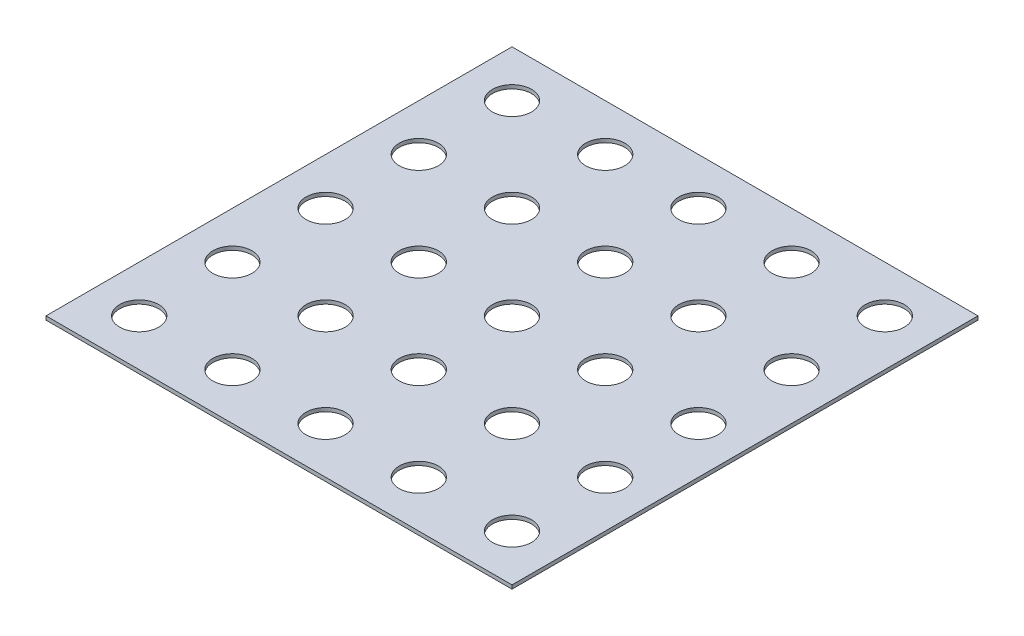
ISO-10303-21;
HEADER;
FILE_DESCRIPTION(('STEP AP214'),'2;1');
FILE_NAME('part.step','',(''),(''),'','','');
FILE_SCHEMA(('AUTOMOTIVE_DESIGN { 1 0 10303 214 1 1 1 1 }'));
ENDSEC;
DATA;
#1=APPLICATION_CONTEXT('core data for automotive mechanical design processes');
#2=APPLICATION_PROTOCOL_DEFINITION('international standard','automotive_design',2000,#1);
#3=PRODUCT_CONTEXT('',#1,'mechanical');
#4=PRODUCT('Part','Part','',(#3));
#5=PRODUCT_RELATED_PRODUCT_CATEGORY('part','',(#4));
#6=PRODUCT_DEFINITION_FORMATION('','',#4);
#7=PRODUCT_DEFINITION_CONTEXT('part definition',#1,'design');
#8=PRODUCT_DEFINITION('design','',#6,#7);
#9=PRODUCT_DEFINITION_SHAPE('','',#8);
#10=(LENGTH_UNIT() NAMED_UNIT(*) SI_UNIT(.MILLI.,.METRE.));
#11=(NAMED_UNIT(*) PLANE_ANGLE_UNIT() SI_UNIT($,.RADIAN.));
#12=(NAMED_UNIT(*) SI_UNIT($,.STERADIAN.) SOLID_ANGLE_UNIT());
#13=UNCERTAINTY_MEASURE_WITH_UNIT(LENGTH_MEASURE(1.E-05),#10,'distance_accuracy_value','');
#14=(GEOMETRIC_REPRESENTATION_CONTEXT(3) GLOBAL_UNCERTAINTY_ASSIGNED_CONTEXT((#13)) GLOBAL_UNIT_ASSIGNED_CONTEXT((#10,
#11,#12)) REPRESENTATION_CONTEXT('',''));
#15=CARTESIAN_POINT('',(0.,0.,0.));
#16=DIRECTION('',(0.,0.,1.));
#17=DIRECTION('',(1.,0.,0.));
#18=AXIS2_PLACEMENT_3D('',#15,#16,#17);
#19=CARTESIAN_POINT('',(-125.,2.,-125.));
#20=DIRECTION('',(1.,0.,0.));
#21=DIRECTION('',(0.,0.,-1.));
#22=AXIS2_PLACEMENT_3D('',#19,#20,#21);
#23=PLANE('',#22);
#24=DIRECTION('',(0.,0.,1.));
#25=VECTOR('',#24,1.);
#26=CARTESIAN_POINT('',(-125.,0.,-125.));
#27=LINE('',#26,#25);
#28=CARTESIAN_POINT('',(-125.,0.,-125.));
#29=VERTEX_POINT('',#28);
#30=CARTESIAN_POINT('',(-125.,0.,125.));
#31=VERTEX_POINT('',#30);
#32=EDGE_CURVE('E107',#29,#31,#27,.T.);
#33=ORIENTED_EDGE('',*,*,#32,.T.);
#34=DIRECTION('',(0.,-1.,0.));
#35=VECTOR('',#34,1.);
#36=CARTESIAN_POINT('',(-125.,2.,125.));
#37=LINE('',#36,#35);
#38=CARTESIAN_POINT('',(-125.,2.,125.));
#39=VERTEX_POINT('',#38);
#40=EDGE_CURVE('E11',#39,#31,#37,.T.);
#41=ORIENTED_EDGE('',*,*,#40,.F.);
#42=DIRECTION('',(0.,0.,1.));
#43=VECTOR('',#42,1.);
#44=CARTESIAN_POINT('',(-125.,2.,-125.));
#45=LINE('',#44,#43);
#46=CARTESIAN_POINT('',(-125.,2.,-125.));
#47=VERTEX_POINT('',#46);
#48=EDGE_CURVE('E91',#47,#39,#45,.T.);
#49=ORIENTED_EDGE('',*,*,#48,.F.);
#50=DIRECTION('',(0.,-1.,0.));
#51=VECTOR('',#50,1.);
#52=CARTESIAN_POINT('',(-125.,2.,-125.));
#53=LINE('',#52,#51);
#54=EDGE_CURVE('E103',#47,#29,#53,.T.);
#55=ORIENTED_EDGE('',*,*,#54,.T.);
#56=EDGE_LOOP('',(#33,#41,#49,#55));
#57=FACE_BOUND('',#56,.T.);
#58=ADVANCED_FACE('F39',(#57),#23,.F.);
#59=CARTESIAN_POINT('',(-125.,2.,125.));
#60=DIRECTION('',(0.,0.,-1.));
#61=DIRECTION('',(-1.,0.,0.));
#62=AXIS2_PLACEMENT_3D('',#59,#60,#61);
#63=PLANE('',#62);
#64=DIRECTION('',(1.,0.,0.));
#65=VECTOR('',#64,1.);
#66=CARTESIAN_POINT('',(-125.,0.,125.));
#67=LINE('',#66,#65);
#68=CARTESIAN_POINT('',(125.,0.,125.));
#69=VERTEX_POINT('',#68);
#70=EDGE_CURVE('E96',#31,#69,#67,.T.);
#71=ORIENTED_EDGE('',*,*,#70,.T.);
#72=DIRECTION('',(0.,-1.,0.));
#73=VECTOR('',#72,1.);
#74=CARTESIAN_POINT('',(125.,2.,125.));
#75=LINE('',#74,#73);
#76=CARTESIAN_POINT('',(125.,2.,125.));
#77=VERTEX_POINT('',#76);
#78=EDGE_CURVE('E48',#77,#69,#75,.T.);
#79=ORIENTED_EDGE('',*,*,#78,.F.);
#80=DIRECTION('',(1.,0.,0.));
#81=VECTOR('',#80,1.);
#82=CARTESIAN_POINT('',(-125.,2.,125.));
#83=LINE('',#82,#81);
#84=EDGE_CURVE('E86',#39,#77,#83,.T.);
#85=ORIENTED_EDGE('',*,*,#84,.F.);
#86=ORIENTED_EDGE('',*,*,#40,.T.);
#87=EDGE_LOOP('',(#71,#79,#85,#86));
#88=FACE_BOUND('',#87,.T.);
#89=ADVANCED_FACE('F95',(#88),#63,.F.);
#90=CARTESIAN_POINT('',(125.,2.,-125.));
#91=DIRECTION('',(-1.,0.,0.));
#92=DIRECTION('',(0.,0.,1.));
#93=AXIS2_PLACEMENT_3D('',#90,#91,#92);
#94=PLANE('',#93);
#95=DIRECTION('',(0.,0.,-1.));
#96=VECTOR('',#95,1.);
#97=CARTESIAN_POINT('',(125.,0.,-125.));
#98=LINE('',#97,#96);
#99=CARTESIAN_POINT('',(125.,0.,-125.));
#100=VERTEX_POINT('',#99);
#101=EDGE_CURVE('E73',#69,#100,#98,.T.);
#102=ORIENTED_EDGE('',*,*,#101,.T.);
#103=DIRECTION('',(0.,-1.,0.));
#104=VECTOR('',#103,1.);
#105=CARTESIAN_POINT('',(125.,2.,-125.));
#106=LINE('',#105,#104);
#107=CARTESIAN_POINT('',(125.,2.,-125.));
#108=VERTEX_POINT('',#107);
#109=EDGE_CURVE('E98',#108,#100,#106,.T.);
#110=ORIENTED_EDGE('',*,*,#109,.F.);
#111=DIRECTION('',(0.,0.,-1.));
#112=VECTOR('',#111,1.);
#113=CARTESIAN_POINT('',(125.,2.,-125.));
#114=LINE('',#113,#112);
#115=EDGE_CURVE('E89',#77,#108,#114,.T.);
#116=ORIENTED_EDGE('',*,*,#115,.F.);
#117=ORIENTED_EDGE('',*,*,#78,.T.);
#118=EDGE_LOOP('',(#102,#110,#116,#117));
#119=FACE_BOUND('',#118,.T.);
#120=ADVANCED_FACE('F99',(#119),#94,.F.);
#121=CARTESIAN_POINT('',(-125.,2.,-125.));
#122=DIRECTION('',(0.,0.,1.));
#123=DIRECTION('',(1.,0.,0.));
#124=AXIS2_PLACEMENT_3D('',#121,#122,#123);
#125=PLANE('',#124);
#126=DIRECTION('',(-1.,0.,0.));
#127=VECTOR('',#126,1.);
#128=CARTESIAN_POINT('',(-125.,0.,-125.));
#129=LINE('',#128,#127);
#130=EDGE_CURVE('E79',#100,#29,#129,.T.);
#131=ORIENTED_EDGE('',*,*,#130,.T.);
#132=ORIENTED_EDGE('',*,*,#54,.F.);
#133=DIRECTION('',(-1.,0.,0.));
#134=VECTOR('',#133,1.);
#135=CARTESIAN_POINT('',(-125.,2.,-125.));
#136=LINE('',#135,#134);
#137=EDGE_CURVE('E56',#108,#47,#136,.T.);
#138=ORIENTED_EDGE('',*,*,#137,.F.);
#139=ORIENTED_EDGE('',*,*,#109,.T.);
#140=EDGE_LOOP('',(#131,#132,#138,#139));
#141=FACE_BOUND('',#140,.T.);
#142=ADVANCED_FACE('F121',(#141),#125,.F.);
#143=CARTESIAN_POINT('',(0.,2.,0.));
#144=DIRECTION('',(0.,1.,0.));
#145=DIRECTION('',(0.,0.,1.));
#146=AXIS2_PLACEMENT_3D('',#143,#144,#145);
#147=PLANE('',#146);
#148=CARTESIAN_POINT('',(-50.,2.,-100.));
#149=DIRECTION('',(0.,1.,0.));
#150=DIRECTION('',(0.,0.,1.));
#151=AXIS2_PLACEMENT_3D('',#148,#149,#150);
#152=CIRCLE('',#151,10.5);
#153=CARTESIAN_POINT('',(-50.,2.,-89.5));
#154=VERTEX_POINT('',#153);
#155=EDGE_CURVE('E257',#154,#154,#152,.T.);
#156=ORIENTED_EDGE('',*,*,#155,.F.);
#157=EDGE_LOOP('',(#156));
#158=FACE_BOUND('',#157,.T.);
#159=CARTESIAN_POINT('',(0.,2.,-100.));
#160=DIRECTION('',(0.,1.,0.));
#161=DIRECTION('',(0.,0.,1.));
#162=AXIS2_PLACEMENT_3D('',#159,#160,#161);
#163=CIRCLE('',#162,10.5);
#164=CARTESIAN_POINT('',(0.,2.,-89.5));
#165=VERTEX_POINT('',#164);
#166=EDGE_CURVE('E249',#165,#165,#163,.T.);
#167=ORIENTED_EDGE('',*,*,#166,.F.);
#168=EDGE_LOOP('',(#167));
#169=FACE_BOUND('',#168,.T.);
#170=CARTESIAN_POINT('',(50.,2.,-100.));
#171=DIRECTION('',(0.,1.,0.));
#172=DIRECTION('',(0.,0.,1.));
#173=AXIS2_PLACEMENT_3D('',#170,#171,#172);
#174=CIRCLE('',#173,10.5);
#175=CARTESIAN_POINT('',(50.,2.,-89.5));
#176=VERTEX_POINT('',#175);
#177=EDGE_CURVE('E241',#176,#176,#174,.T.);
#178=ORIENTED_EDGE('',*,*,#177,.F.);
#179=EDGE_LOOP('',(#178));
#180=FACE_BOUND('',#179,.T.);
#181=CARTESIAN_POINT('',(100.,2.,-100.));
#182=DIRECTION('',(0.,1.,0.));
#183=DIRECTION('',(0.,0.,1.));
#184=AXIS2_PLACEMENT_3D('',#181,#182,#183);
#185=CIRCLE('',#184,10.5);
#186=CARTESIAN_POINT('',(100.,2.,-89.5));
#187=VERTEX_POINT('',#186);
#188=EDGE_CURVE('E233',#187,#187,#185,.T.);
#189=ORIENTED_EDGE('',*,*,#188,.F.);
#190=EDGE_LOOP('',(#189));
#191=FACE_BOUND('',#190,.T.);
#192=CARTESIAN_POINT('',(-49.9999999999995,2.,-50.));
#193=DIRECTION('',(0.,1.,0.));
#194=DIRECTION('',(0.,0.,1.));
#195=AXIS2_PLACEMENT_3D('',#192,#193,#194);
#196=CIRCLE('',#195,10.5);
#197=CARTESIAN_POINT('',(-49.9999999999995,2.,-39.5));
#198=VERTEX_POINT('',#197);
#199=EDGE_CURVE('E225',#198,#198,#196,.T.);
#200=ORIENTED_EDGE('',*,*,#199,.F.);
#201=EDGE_LOOP('',(#200));
#202=FACE_BOUND('',#201,.T.);
#203=CARTESIAN_POINT('',(5.55111512312578E-13,2.,-50.));
#204=DIRECTION('',(0.,1.,0.));
#205=DIRECTION('',(0.,0.,1.));
#206=AXIS2_PLACEMENT_3D('',#203,#204,#205);
#207=CIRCLE('',#206,10.5);
#208=CARTESIAN_POINT('',(5.55111512312578E-13,2.,-39.5));
#209=VERTEX_POINT('',#208);
#210=EDGE_CURVE('E217',#209,#209,#207,.T.);
#211=ORIENTED_EDGE('',*,*,#210,.F.);
#212=EDGE_LOOP('',(#211));
#213=FACE_BOUND('',#212,.T.);
#214=CARTESIAN_POINT('',(50.0000000000006,2.,-50.));
#215=DIRECTION('',(0.,1.,0.));
#216=DIRECTION('',(0.,0.,1.));
#217=AXIS2_PLACEMENT_3D('',#214,#215,#216);
#218=CIRCLE('',#217,10.5);
#219=CARTESIAN_POINT('',(50.0000000000006,2.,-39.5));
#220=VERTEX_POINT('',#219);
#221=EDGE_CURVE('E209',#220,#220,#218,.T.);
#222=ORIENTED_EDGE('',*,*,#221,.F.);
#223=EDGE_LOOP('',(#222));
#224=FACE_BOUND('',#223,.T.);
#225=CARTESIAN_POINT('',(100.000000000001,2.,-50.));
#226=DIRECTION('',(0.,1.,0.));
#227=DIRECTION('',(0.,0.,1.));
#228=AXIS2_PLACEMENT_3D('',#225,#226,#227);
#229=CIRCLE('',#228,10.5);
#230=CARTESIAN_POINT('',(100.000000000001,2.,-39.5));
#231=VERTEX_POINT('',#230);
#232=EDGE_CURVE('E201',#231,#231,#229,.T.);
#233=ORIENTED_EDGE('',*,*,#232,.F.);
#234=EDGE_LOOP('',(#233));
#235=FACE_BOUND('',#234,.T.);
#236=CARTESIAN_POINT('',(-49.9999999999989,2.,0.));
#237=DIRECTION('',(0.,1.,0.));
#238=DIRECTION('',(0.,0.,1.));
#239=AXIS2_PLACEMENT_3D('',#236,#237,#238);
#240=CIRCLE('',#239,10.5);
#241=CARTESIAN_POINT('',(-49.9999999999989,2.,10.5));
#242=VERTEX_POINT('',#241);
#243=EDGE_CURVE('E193',#242,#242,#240,.T.);
#244=ORIENTED_EDGE('',*,*,#243,.F.);
#245=EDGE_LOOP('',(#244));
#246=FACE_BOUND('',#245,.T.);
#247=CARTESIAN_POINT('',(1.06858966120171E-12,2.,0.));
#248=DIRECTION('',(0.,1.,0.));
#249=DIRECTION('',(0.,0.,1.));
#250=AXIS2_PLACEMENT_3D('',#247,#248,#249);
#251=CIRCLE('',#250,10.5);
#252=CARTESIAN_POINT('',(1.06858966120171E-12,2.,10.5));
#253=VERTEX_POINT('',#252);
#254=EDGE_CURVE('E185',#253,#253,#251,.T.);
#255=ORIENTED_EDGE('',*,*,#254,.F.);
#256=EDGE_LOOP('',(#255));
#257=FACE_BOUND('',#256,.T.);
#258=CARTESIAN_POINT('',(50.0000000000011,2.,0.));
#259=DIRECTION('',(0.,1.,0.));
#260=DIRECTION('',(0.,0.,1.));
#261=AXIS2_PLACEMENT_3D('',#258,#259,#260);
#262=CIRCLE('',#261,10.5);
#263=CARTESIAN_POINT('',(50.0000000000011,2.,10.5));
#264=VERTEX_POINT('',#263);
#265=EDGE_CURVE('E177',#264,#264,#262,.T.);
#266=ORIENTED_EDGE('',*,*,#265,.F.);
#267=EDGE_LOOP('',(#266));
#268=FACE_BOUND('',#267,.T.);
#269=CARTESIAN_POINT('',(100.000000000001,2.,0.));
#270=DIRECTION('',(0.,1.,0.));
#271=DIRECTION('',(0.,0.,1.));
#272=AXIS2_PLACEMENT_3D('',#269,#270,#271);
#273=CIRCLE('',#272,10.5);
#274=CARTESIAN_POINT('',(100.000000000001,2.,10.5));
#275=VERTEX_POINT('',#274);
#276=EDGE_CURVE('E169',#275,#275,#273,.T.);
#277=ORIENTED_EDGE('',*,*,#276,.F.);
#278=EDGE_LOOP('',(#277));
#279=FACE_BOUND('',#278,.T.);
#280=CARTESIAN_POINT('',(-49.9999999999984,2.,50.));
#281=DIRECTION('',(0.,1.,0.));
#282=DIRECTION('',(0.,0.,1.));
#283=AXIS2_PLACEMENT_3D('',#280,#281,#282);
#284=CIRCLE('',#283,10.5);
#285=CARTESIAN_POINT('',(-49.9999999999984,2.,60.5));
#286=VERTEX_POINT('',#285);
#287=EDGE_CURVE('E161',#286,#286,#284,.T.);
#288=ORIENTED_EDGE('',*,*,#287,.F.);
#289=EDGE_LOOP('',(#288));
#290=FACE_BOUND('',#289,.T.);
#291=CARTESIAN_POINT('',(1.59594559789866E-12,2.,50.));
#292=DIRECTION('',(0.,1.,0.));
#293=DIRECTION('',(0.,0.,1.));
#294=AXIS2_PLACEMENT_3D('',#291,#292,#293);
#295=CIRCLE('',#294,10.5);
#296=CARTESIAN_POINT('',(1.59594559789866E-12,2.,60.5));
#297=VERTEX_POINT('',#296);
#298=EDGE_CURVE('E153',#297,#297,#295,.T.);
#299=ORIENTED_EDGE('',*,*,#298,.F.);
#300=EDGE_LOOP('',(#299));
#301=FACE_BOUND('',#300,.T.);
#302=CARTESIAN_POINT('',(50.0000000000016,2.,50.));
#303=DIRECTION('',(0.,1.,0.));
#304=DIRECTION('',(0.,0.,1.));
#305=AXIS2_PLACEMENT_3D('',#302,#303,#304);
#306=CIRCLE('',#305,10.5);
#307=CARTESIAN_POINT('',(50.0000000000016,2.,60.5));
#308=VERTEX_POINT('',#307);
#309=EDGE_CURVE('E145',#308,#308,#306,.T.);
#310=ORIENTED_EDGE('',*,*,#309,.F.);
#311=EDGE_LOOP('',(#310));
#312=FACE_BOUND('',#311,.T.);
#313=CARTESIAN_POINT('',(100.000000000002,2.,50.));
#314=DIRECTION('',(0.,1.,0.));
#315=DIRECTION('',(0.,0.,1.));
#316=AXIS2_PLACEMENT_3D('',#313,#314,#315);
#317=CIRCLE('',#316,10.5);
#318=CARTESIAN_POINT('',(100.000000000002,2.,60.5));
#319=VERTEX_POINT('',#318);
#320=EDGE_CURVE('E136',#319,#319,#317,.T.);
#321=ORIENTED_EDGE('',*,*,#320,.F.);
#322=EDGE_LOOP('',(#321));
#323=FACE_BOUND('',#322,.T.);
#324=CARTESIAN_POINT('',(-49.9999999999979,2.,100.));
#325=DIRECTION('',(0.,1.,0.));
#326=DIRECTION('',(0.,0.,1.));
#327=AXIS2_PLACEMENT_3D('',#324,#325,#326);
#328=CIRCLE('',#327,10.5);
#329=CARTESIAN_POINT('',(-49.9999999999979,2.,110.5));
#330=VERTEX_POINT('',#329);
#331=EDGE_CURVE('E320',#330,#330,#328,.T.);
#332=ORIENTED_EDGE('',*,*,#331,.F.);
#333=EDGE_LOOP('',(#332));
#334=FACE_BOUND('',#333,.T.);
#335=CARTESIAN_POINT('',(2.1094237467878E-12,2.,100.));
#336=DIRECTION('',(0.,1.,0.));
#337=DIRECTION('',(0.,0.,1.));
#338=AXIS2_PLACEMENT_3D('',#335,#336,#337);
#339=CIRCLE('',#338,10.5);
#340=CARTESIAN_POINT('',(2.1094237467878E-12,2.,110.5));
#341=VERTEX_POINT('',#340);
#342=EDGE_CURVE('E312',#341,#341,#339,.T.);
#343=ORIENTED_EDGE('',*,*,#342,.F.);
#344=EDGE_LOOP('',(#343));
#345=FACE_BOUND('',#344,.T.);
#346=CARTESIAN_POINT('',(50.0000000000021,2.,100.));
#347=DIRECTION('',(0.,1.,0.));
#348=DIRECTION('',(0.,0.,1.));
#349=AXIS2_PLACEMENT_3D('',#346,#347,#348);
#350=CIRCLE('',#349,10.5);
#351=CARTESIAN_POINT('',(50.0000000000021,2.,110.5));
#352=VERTEX_POINT('',#351);
#353=EDGE_CURVE('E304',#352,#352,#350,.T.);
#354=ORIENTED_EDGE('',*,*,#353,.F.);
#355=EDGE_LOOP('',(#354));
#356=FACE_BOUND('',#355,.T.);
#357=CARTESIAN_POINT('',(100.000000000002,2.,100.));
#358=DIRECTION('',(0.,1.,0.));
#359=DIRECTION('',(0.,0.,1.));
#360=AXIS2_PLACEMENT_3D('',#357,#358,#359);
#361=CIRCLE('',#360,10.5);
#362=CARTESIAN_POINT('',(100.000000000002,2.,110.5));
#363=VERTEX_POINT('',#362);
#364=EDGE_CURVE('E296',#363,#363,#361,.T.);
#365=ORIENTED_EDGE('',*,*,#364,.F.);
#366=EDGE_LOOP('',(#365));
#367=FACE_BOUND('',#366,.T.);
#368=CARTESIAN_POINT('',(-99.9999999999994,2.,-50.));
#369=DIRECTION('',(0.,1.,0.));
#370=DIRECTION('',(0.,0.,1.));
#371=AXIS2_PLACEMENT_3D('',#368,#369,#370);
#372=CIRCLE('',#371,10.5);
#373=CARTESIAN_POINT('',(-99.9999999999994,2.,-39.5));
#374=VERTEX_POINT('',#373);
#375=EDGE_CURVE('E288',#374,#374,#372,.T.);
#376=ORIENTED_EDGE('',*,*,#375,.F.);
#377=EDGE_LOOP('',(#376));
#378=FACE_BOUND('',#377,.T.);
#379=CARTESIAN_POINT('',(-99.9999999999989,2.,0.));
#380=DIRECTION('',(0.,1.,0.));
#381=DIRECTION('',(0.,0.,1.));
#382=AXIS2_PLACEMENT_3D('',#379,#380,#381);
#383=CIRCLE('',#382,10.5);
#384=CARTESIAN_POINT('',(-99.9999999999989,2.,10.5));
#385=VERTEX_POINT('',#384);
#386=EDGE_CURVE('E280',#385,#385,#383,.T.);
#387=ORIENTED_EDGE('',*,*,#386,.F.);
#388=EDGE_LOOP('',(#387));
#389=FACE_BOUND('',#388,.T.);
#390=CARTESIAN_POINT('',(-99.9999999999984,2.,50.));
#391=DIRECTION('',(0.,1.,0.));
#392=DIRECTION('',(0.,0.,1.));
#393=AXIS2_PLACEMENT_3D('',#390,#391,#392);
#394=CIRCLE('',#393,10.5);
#395=CARTESIAN_POINT('',(-99.9999999999984,2.,60.5));
#396=VERTEX_POINT('',#395);
#397=EDGE_CURVE('E272',#396,#396,#394,.T.);
#398=ORIENTED_EDGE('',*,*,#397,.F.);
#399=EDGE_LOOP('',(#398));
#400=FACE_BOUND('',#399,.T.);
#401=CARTESIAN_POINT('',(-99.9999999999979,2.,100.));
#402=DIRECTION('',(0.,1.,0.));
#403=DIRECTION('',(0.,0.,1.));
#404=AXIS2_PLACEMENT_3D('',#401,#402,#403);
#405=CIRCLE('',#404,10.5);
#406=CARTESIAN_POINT('',(-99.9999999999979,2.,110.5));
#407=VERTEX_POINT('',#406);
#408=EDGE_CURVE('E264',#407,#407,#405,.T.);
#409=ORIENTED_EDGE('',*,*,#408,.F.);
#410=EDGE_LOOP('',(#409));
#411=FACE_BOUND('',#410,.T.);
#412=CARTESIAN_POINT('',(-100.,2.,-100.));
#413=DIRECTION('',(0.,1.,0.));
#414=DIRECTION('',(0.,0.,1.));
#415=AXIS2_PLACEMENT_3D('',#412,#413,#414);
#416=CIRCLE('',#415,10.5);
#417=CARTESIAN_POINT('',(-100.,2.,-89.5));
#418=VERTEX_POINT('',#417);
#419=EDGE_CURVE('E128',#418,#418,#416,.T.);
#420=ORIENTED_EDGE('',*,*,#419,.F.);
#421=EDGE_LOOP('',(#420));
#422=FACE_BOUND('',#421,.T.);
#423=ORIENTED_EDGE('',*,*,#48,.T.);
#424=ORIENTED_EDGE('',*,*,#84,.T.);
#425=ORIENTED_EDGE('',*,*,#115,.T.);
#426=ORIENTED_EDGE('',*,*,#137,.T.);
#427=EDGE_LOOP('',(#423,#424,#425,#426));
#428=FACE_BOUND('',#427,.T.);
#429=ADVANCED_FACE('F87',(#158,#169,#180,#191,#202,#213,#224,#235,#246,#257,#268,#279,#290,#301,
#312,#323,#334,#345,#356,#367,#378,#389,#400,#411,#422,#428),#147,.T.);
#430=CARTESIAN_POINT('',(0.,0.,0.));
#431=DIRECTION('',(0.,1.,0.));
#432=DIRECTION('',(0.,0.,1.));
#433=AXIS2_PLACEMENT_3D('',#430,#431,#432);
#434=PLANE('',#433);
#435=CARTESIAN_POINT('',(-50.,0.,-100.));
#436=DIRECTION('',(0.,1.,0.));
#437=DIRECTION('',(0.,0.,1.));
#438=AXIS2_PLACEMENT_3D('',#435,#436,#437);
#439=CIRCLE('',#438,10.5);
#440=CARTESIAN_POINT('',(-50.,0.,-89.5));
#441=VERTEX_POINT('',#440);
#442=EDGE_CURVE('E132',#441,#441,#439,.T.);
#443=ORIENTED_EDGE('',*,*,#442,.T.);
#444=EDGE_LOOP('',(#443));
#445=FACE_BOUND('',#444,.T.);
#446=CARTESIAN_POINT('',(0.,0.,-100.));
#447=DIRECTION('',(0.,1.,0.));
#448=DIRECTION('',(0.,0.,1.));
#449=AXIS2_PLACEMENT_3D('',#446,#447,#448);
#450=CIRCLE('',#449,10.5);
#451=CARTESIAN_POINT('',(0.,0.,-89.5));
#452=VERTEX_POINT('',#451);
#453=EDGE_CURVE('E253',#452,#452,#450,.T.);
#454=ORIENTED_EDGE('',*,*,#453,.T.);
#455=EDGE_LOOP('',(#454));
#456=FACE_BOUND('',#455,.T.);
#457=CARTESIAN_POINT('',(50.,0.,-100.));
#458=DIRECTION('',(0.,1.,0.));
#459=DIRECTION('',(0.,0.,1.));
#460=AXIS2_PLACEMENT_3D('',#457,#458,#459);
#461=CIRCLE('',#460,10.5);
#462=CARTESIAN_POINT('',(50.,0.,-89.5));
#463=VERTEX_POINT('',#462);
#464=EDGE_CURVE('E245',#463,#463,#461,.T.);
#465=ORIENTED_EDGE('',*,*,#464,.T.);
#466=EDGE_LOOP('',(#465));
#467=FACE_BOUND('',#466,.T.);
#468=CARTESIAN_POINT('',(100.,0.,-100.));
#469=DIRECTION('',(0.,1.,0.));
#470=DIRECTION('',(0.,0.,1.));
#471=AXIS2_PLACEMENT_3D('',#468,#469,#470);
#472=CIRCLE('',#471,10.5);
#473=CARTESIAN_POINT('',(100.,0.,-89.5));
#474=VERTEX_POINT('',#473);
#475=EDGE_CURVE('E237',#474,#474,#472,.T.);
#476=ORIENTED_EDGE('',*,*,#475,.T.);
#477=EDGE_LOOP('',(#476));
#478=FACE_BOUND('',#477,.T.);
#479=CARTESIAN_POINT('',(-49.9999999999995,0.,-50.));
#480=DIRECTION('',(0.,1.,0.));
#481=DIRECTION('',(0.,0.,1.));
#482=AXIS2_PLACEMENT_3D('',#479,#480,#481);
#483=CIRCLE('',#482,10.5);
#484=CARTESIAN_POINT('',(-49.9999999999995,0.,-39.5));
#485=VERTEX_POINT('',#484);
#486=EDGE_CURVE('E229',#485,#485,#483,.T.);
#487=ORIENTED_EDGE('',*,*,#486,.T.);
#488=EDGE_LOOP('',(#487));
#489=FACE_BOUND('',#488,.T.);
#490=CARTESIAN_POINT('',(5.55111512312578E-13,0.,-50.));
#491=DIRECTION('',(0.,1.,0.));
#492=DIRECTION('',(0.,0.,1.));
#493=AXIS2_PLACEMENT_3D('',#490,#491,#492);
#494=CIRCLE('',#493,10.5);
#495=CARTESIAN_POINT('',(5.55111512312578E-13,0.,-39.5));
#496=VERTEX_POINT('',#495);
#497=EDGE_CURVE('E221',#496,#496,#494,.T.);
#498=ORIENTED_EDGE('',*,*,#497,.T.);
#499=EDGE_LOOP('',(#498));
#500=FACE_BOUND('',#499,.T.);
#501=CARTESIAN_POINT('',(50.0000000000006,0.,-50.));
#502=DIRECTION('',(0.,1.,0.));
#503=DIRECTION('',(0.,0.,1.));
#504=AXIS2_PLACEMENT_3D('',#501,#502,#503);
#505=CIRCLE('',#504,10.5);
#506=CARTESIAN_POINT('',(50.0000000000006,0.,-39.5));
#507=VERTEX_POINT('',#506);
#508=EDGE_CURVE('E213',#507,#507,#505,.T.);
#509=ORIENTED_EDGE('',*,*,#508,.T.);
#510=EDGE_LOOP('',(#509));
#511=FACE_BOUND('',#510,.T.);
#512=CARTESIAN_POINT('',(100.000000000001,0.,-50.));
#513=DIRECTION('',(0.,1.,0.));
#514=DIRECTION('',(0.,0.,1.));
#515=AXIS2_PLACEMENT_3D('',#512,#513,#514);
#516=CIRCLE('',#515,10.5);
#517=CARTESIAN_POINT('',(100.000000000001,0.,-39.5));
#518=VERTEX_POINT('',#517);
#519=EDGE_CURVE('E205',#518,#518,#516,.T.);
#520=ORIENTED_EDGE('',*,*,#519,.T.);
#521=EDGE_LOOP('',(#520));
#522=FACE_BOUND('',#521,.T.);
#523=CARTESIAN_POINT('',(-49.9999999999989,0.,0.));
#524=DIRECTION('',(0.,1.,0.));
#525=DIRECTION('',(0.,0.,1.));
#526=AXIS2_PLACEMENT_3D('',#523,#524,#525);
#527=CIRCLE('',#526,10.5);
#528=CARTESIAN_POINT('',(-49.9999999999989,0.,10.5));
#529=VERTEX_POINT('',#528);
#530=EDGE_CURVE('E197',#529,#529,#527,.T.);
#531=ORIENTED_EDGE('',*,*,#530,.T.);
#532=EDGE_LOOP('',(#531));
#533=FACE_BOUND('',#532,.T.);
#534=CARTESIAN_POINT('',(1.06858966120171E-12,0.,0.));
#535=DIRECTION('',(0.,1.,0.));
#536=DIRECTION('',(0.,0.,1.));
#537=AXIS2_PLACEMENT_3D('',#534,#535,#536);
#538=CIRCLE('',#537,10.5);
#539=CARTESIAN_POINT('',(1.06858966120171E-12,0.,10.5));
#540=VERTEX_POINT('',#539);
#541=EDGE_CURVE('E189',#540,#540,#538,.T.);
#542=ORIENTED_EDGE('',*,*,#541,.T.);
#543=EDGE_LOOP('',(#542));
#544=FACE_BOUND('',#543,.T.);
#545=CARTESIAN_POINT('',(50.0000000000011,0.,0.));
#546=DIRECTION('',(0.,1.,0.));
#547=DIRECTION('',(0.,0.,1.));
#548=AXIS2_PLACEMENT_3D('',#545,#546,#547);
#549=CIRCLE('',#548,10.5);
#550=CARTESIAN_POINT('',(50.0000000000011,0.,10.5));
#551=VERTEX_POINT('',#550);
#552=EDGE_CURVE('E181',#551,#551,#549,.T.);
#553=ORIENTED_EDGE('',*,*,#552,.T.);
#554=EDGE_LOOP('',(#553));
#555=FACE_BOUND('',#554,.T.);
#556=CARTESIAN_POINT('',(100.000000000001,0.,0.));
#557=DIRECTION('',(0.,1.,0.));
#558=DIRECTION('',(0.,0.,1.));
#559=AXIS2_PLACEMENT_3D('',#556,#557,#558);
#560=CIRCLE('',#559,10.5);
#561=CARTESIAN_POINT('',(100.000000000001,0.,10.5));
#562=VERTEX_POINT('',#561);
#563=EDGE_CURVE('E173',#562,#562,#560,.T.);
#564=ORIENTED_EDGE('',*,*,#563,.T.);
#565=EDGE_LOOP('',(#564));
#566=FACE_BOUND('',#565,.T.);
#567=CARTESIAN_POINT('',(-49.9999999999984,0.,50.));
#568=DIRECTION('',(0.,1.,0.));
#569=DIRECTION('',(0.,0.,1.));
#570=AXIS2_PLACEMENT_3D('',#567,#568,#569);
#571=CIRCLE('',#570,10.5);
#572=CARTESIAN_POINT('',(-49.9999999999984,0.,60.5));
#573=VERTEX_POINT('',#572);
#574=EDGE_CURVE('E165',#573,#573,#571,.T.);
#575=ORIENTED_EDGE('',*,*,#574,.T.);
#576=EDGE_LOOP('',(#575));
#577=FACE_BOUND('',#576,.T.);
#578=CARTESIAN_POINT('',(1.59594559789866E-12,0.,50.));
#579=DIRECTION('',(0.,1.,0.));
#580=DIRECTION('',(0.,0.,1.));
#581=AXIS2_PLACEMENT_3D('',#578,#579,#580);
#582=CIRCLE('',#581,10.5);
#583=CARTESIAN_POINT('',(1.59594559789866E-12,0.,60.5));
#584=VERTEX_POINT('',#583);
#585=EDGE_CURVE('E157',#584,#584,#582,.T.);
#586=ORIENTED_EDGE('',*,*,#585,.T.);
#587=EDGE_LOOP('',(#586));
#588=FACE_BOUND('',#587,.T.);
#589=CARTESIAN_POINT('',(50.0000000000016,0.,50.));
#590=DIRECTION('',(0.,1.,0.));
#591=DIRECTION('',(0.,0.,1.));
#592=AXIS2_PLACEMENT_3D('',#589,#590,#591);
#593=CIRCLE('',#592,10.5);
#594=CARTESIAN_POINT('',(50.0000000000016,0.,60.5));
#595=VERTEX_POINT('',#594);
#596=EDGE_CURVE('E149',#595,#595,#593,.T.);
#597=ORIENTED_EDGE('',*,*,#596,.T.);
#598=EDGE_LOOP('',(#597));
#599=FACE_BOUND('',#598,.T.);
#600=CARTESIAN_POINT('',(100.000000000002,0.,50.));
#601=DIRECTION('',(0.,1.,0.));
#602=DIRECTION('',(0.,0.,1.));
#603=AXIS2_PLACEMENT_3D('',#600,#601,#602);
#604=CIRCLE('',#603,10.5);
#605=CARTESIAN_POINT('',(100.000000000002,0.,60.5));
#606=VERTEX_POINT('',#605);
#607=EDGE_CURVE('E140',#606,#606,#604,.T.);
#608=ORIENTED_EDGE('',*,*,#607,.T.);
#609=EDGE_LOOP('',(#608));
#610=FACE_BOUND('',#609,.T.);
#611=CARTESIAN_POINT('',(-49.9999999999979,0.,100.));
#612=DIRECTION('',(0.,1.,0.));
#613=DIRECTION('',(0.,0.,1.));
#614=AXIS2_PLACEMENT_3D('',#611,#612,#613);
#615=CIRCLE('',#614,10.5);
#616=CARTESIAN_POINT('',(-49.9999999999979,0.,110.5));
#617=VERTEX_POINT('',#616);
#618=EDGE_CURVE('E141',#617,#617,#615,.T.);
#619=ORIENTED_EDGE('',*,*,#618,.T.);
#620=EDGE_LOOP('',(#619));
#621=FACE_BOUND('',#620,.T.);
#622=CARTESIAN_POINT('',(2.1094237467878E-12,0.,100.));
#623=DIRECTION('',(0.,1.,0.));
#624=DIRECTION('',(0.,0.,1.));
#625=AXIS2_PLACEMENT_3D('',#622,#623,#624);
#626=CIRCLE('',#625,10.5);
#627=CARTESIAN_POINT('',(2.1094237467878E-12,0.,110.5));
#628=VERTEX_POINT('',#627);
#629=EDGE_CURVE('E316',#628,#628,#626,.T.);
#630=ORIENTED_EDGE('',*,*,#629,.T.);
#631=EDGE_LOOP('',(#630));
#632=FACE_BOUND('',#631,.T.);
#633=CARTESIAN_POINT('',(50.0000000000021,0.,100.));
#634=DIRECTION('',(0.,1.,0.));
#635=DIRECTION('',(0.,0.,1.));
#636=AXIS2_PLACEMENT_3D('',#633,#634,#635);
#637=CIRCLE('',#636,10.5);
#638=CARTESIAN_POINT('',(50.0000000000021,0.,110.5));
#639=VERTEX_POINT('',#638);
#640=EDGE_CURVE('E308',#639,#639,#637,.T.);
#641=ORIENTED_EDGE('',*,*,#640,.T.);
#642=EDGE_LOOP('',(#641));
#643=FACE_BOUND('',#642,.T.);
#644=CARTESIAN_POINT('',(100.000000000002,0.,100.));
#645=DIRECTION('',(0.,1.,0.));
#646=DIRECTION('',(0.,0.,1.));
#647=AXIS2_PLACEMENT_3D('',#644,#645,#646);
#648=CIRCLE('',#647,10.5);
#649=CARTESIAN_POINT('',(100.000000000002,0.,110.5));
#650=VERTEX_POINT('',#649);
#651=EDGE_CURVE('E300',#650,#650,#648,.T.);
#652=ORIENTED_EDGE('',*,*,#651,.T.);
#653=EDGE_LOOP('',(#652));
#654=FACE_BOUND('',#653,.T.);
#655=CARTESIAN_POINT('',(-99.9999999999994,0.,-50.));
#656=DIRECTION('',(0.,1.,0.));
#657=DIRECTION('',(0.,0.,1.));
#658=AXIS2_PLACEMENT_3D('',#655,#656,#657);
#659=CIRCLE('',#658,10.5);
#660=CARTESIAN_POINT('',(-99.9999999999994,0.,-39.5));
#661=VERTEX_POINT('',#660);
#662=EDGE_CURVE('E292',#661,#661,#659,.T.);
#663=ORIENTED_EDGE('',*,*,#662,.T.);
#664=EDGE_LOOP('',(#663));
#665=FACE_BOUND('',#664,.T.);
#666=CARTESIAN_POINT('',(-99.9999999999989,0.,0.));
#667=DIRECTION('',(0.,1.,0.));
#668=DIRECTION('',(0.,0.,1.));
#669=AXIS2_PLACEMENT_3D('',#666,#667,#668);
#670=CIRCLE('',#669,10.5);
#671=CARTESIAN_POINT('',(-99.9999999999989,0.,10.5));
#672=VERTEX_POINT('',#671);
#673=EDGE_CURVE('E284',#672,#672,#670,.T.);
#674=ORIENTED_EDGE('',*,*,#673,.T.);
#675=EDGE_LOOP('',(#674));
#676=FACE_BOUND('',#675,.T.);
#677=CARTESIAN_POINT('',(-99.9999999999984,0.,50.));
#678=DIRECTION('',(0.,1.,0.));
#679=DIRECTION('',(0.,0.,1.));
#680=AXIS2_PLACEMENT_3D('',#677,#678,#679);
#681=CIRCLE('',#680,10.5);
#682=CARTESIAN_POINT('',(-99.9999999999984,0.,60.5));
#683=VERTEX_POINT('',#682);
#684=EDGE_CURVE('E276',#683,#683,#681,.T.);
#685=ORIENTED_EDGE('',*,*,#684,.T.);
#686=EDGE_LOOP('',(#685));
#687=FACE_BOUND('',#686,.T.);
#688=CARTESIAN_POINT('',(-99.9999999999979,0.,100.));
#689=DIRECTION('',(0.,1.,0.));
#690=DIRECTION('',(0.,0.,1.));
#691=AXIS2_PLACEMENT_3D('',#688,#689,#690);
#692=CIRCLE('',#691,10.5);
#693=CARTESIAN_POINT('',(-99.9999999999979,0.,110.5));
#694=VERTEX_POINT('',#693);
#695=EDGE_CURVE('E268',#694,#694,#692,.T.);
#696=ORIENTED_EDGE('',*,*,#695,.T.);
#697=EDGE_LOOP('',(#696));
#698=FACE_BOUND('',#697,.T.);
#699=CARTESIAN_POINT('',(-100.,0.,-100.));
#700=DIRECTION('',(0.,1.,0.));
#701=DIRECTION('',(0.,0.,1.));
#702=AXIS2_PLACEMENT_3D('',#699,#700,#701);
#703=CIRCLE('',#702,10.5);
#704=CARTESIAN_POINT('',(-100.,0.,-89.5));
#705=VERTEX_POINT('',#704);
#706=EDGE_CURVE('E111',#705,#705,#703,.T.);
#707=ORIENTED_EDGE('',*,*,#706,.T.);
#708=EDGE_LOOP('',(#707));
#709=FACE_BOUND('',#708,.T.);
#710=ORIENTED_EDGE('',*,*,#32,.F.);
#711=ORIENTED_EDGE('',*,*,#130,.F.);
#712=ORIENTED_EDGE('',*,*,#101,.F.);
#713=ORIENTED_EDGE('',*,*,#70,.F.);
#714=EDGE_LOOP('',(#710,#711,#712,#713));
#715=FACE_BOUND('',#714,.T.);
#716=ADVANCED_FACE('F124',(#445,#456,#467,#478,#489,#500,#511,#522,#533,#544,#555,#566,#577,
#588,#599,#610,#621,#632,#643,#654,#665,#676,#687,#698,#709,#715),#434,.F.);
#717=CARTESIAN_POINT('',(-100.,0.,-100.));
#718=DIRECTION('',(0.,1.,0.));
#719=DIRECTION('',(0.,0.,1.));
#720=AXIS2_PLACEMENT_3D('',#717,#718,#719);
#721=CYLINDRICAL_SURFACE('',#720,10.5);
#722=ORIENTED_EDGE('',*,*,#706,.F.);
#723=EDGE_LOOP('',(#722));
#724=FACE_BOUND('',#723,.T.);
#725=ORIENTED_EDGE('',*,*,#419,.T.);
#726=EDGE_LOOP('',(#725));
#727=FACE_BOUND('',#726,.T.);
#728=ADVANCED_FACE('F358',(#724,#727),#721,.F.);
#729=CARTESIAN_POINT('',(-99.9999999999979,0.,100.));
#730=DIRECTION('',(0.,1.,0.));
#731=DIRECTION('',(0.,0.,1.));
#732=AXIS2_PLACEMENT_3D('',#729,#730,#731);
#733=CYLINDRICAL_SURFACE('',#732,10.5);
#734=ORIENTED_EDGE('',*,*,#695,.F.);
#735=EDGE_LOOP('',(#734));
#736=FACE_BOUND('',#735,.T.);
#737=ORIENTED_EDGE('',*,*,#408,.T.);
#738=EDGE_LOOP('',(#737));
#739=FACE_BOUND('',#738,.T.);
#740=ADVANCED_FACE('F360',(#736,#739),#733,.F.);
#741=CARTESIAN_POINT('',(-99.9999999999984,0.,50.));
#742=DIRECTION('',(0.,1.,0.));
#743=DIRECTION('',(0.,0.,1.));
#744=AXIS2_PLACEMENT_3D('',#741,#742,#743);
#745=CYLINDRICAL_SURFACE('',#744,10.5);
#746=ORIENTED_EDGE('',*,*,#684,.F.);
#747=EDGE_LOOP('',(#746));
#748=FACE_BOUND('',#747,.T.);
#749=ORIENTED_EDGE('',*,*,#397,.T.);
#750=EDGE_LOOP('',(#749));
#751=FACE_BOUND('',#750,.T.);
#752=ADVANCED_FACE('F367',(#748,#751),#745,.F.);
#753=CARTESIAN_POINT('',(-99.9999999999989,0.,0.));
#754=DIRECTION('',(0.,1.,0.));
#755=DIRECTION('',(0.,0.,1.));
#756=AXIS2_PLACEMENT_3D('',#753,#754,#755);
#757=CYLINDRICAL_SURFACE('',#756,10.5);
#758=ORIENTED_EDGE('',*,*,#673,.F.);
#759=EDGE_LOOP('',(#758));
#760=FACE_BOUND('',#759,.T.);
#761=ORIENTED_EDGE('',*,*,#386,.T.);
#762=EDGE_LOOP('',(#761));
#763=FACE_BOUND('',#762,.T.);
#764=ADVANCED_FACE('F415',(#760,#763),#757,.F.);
#765=CARTESIAN_POINT('',(-99.9999999999994,0.,-50.));
#766=DIRECTION('',(0.,1.,0.));
#767=DIRECTION('',(0.,0.,1.));
#768=AXIS2_PLACEMENT_3D('',#765,#766,#767);
#769=CYLINDRICAL_SURFACE('',#768,10.5);
#770=ORIENTED_EDGE('',*,*,#662,.F.);
#771=EDGE_LOOP('',(#770));
#772=FACE_BOUND('',#771,.T.);
#773=ORIENTED_EDGE('',*,*,#375,.T.);
#774=EDGE_LOOP('',(#773));
#775=FACE_BOUND('',#774,.T.);
#776=ADVANCED_FACE('F425',(#772,#775),#769,.F.);
#777=CARTESIAN_POINT('',(100.000000000002,0.,100.));
#778=DIRECTION('',(0.,1.,0.));
#779=DIRECTION('',(0.,0.,1.));
#780=AXIS2_PLACEMENT_3D('',#777,#778,#779);
#781=CYLINDRICAL_SURFACE('',#780,10.5);
#782=ORIENTED_EDGE('',*,*,#651,.F.);
#783=EDGE_LOOP('',(#782));
#784=FACE_BOUND('',#783,.T.);
#785=ORIENTED_EDGE('',*,*,#364,.T.);
#786=EDGE_LOOP('',(#785));
#787=FACE_BOUND('',#786,.T.);
#788=ADVANCED_FACE('F435',(#784,#787),#781,.F.);
#789=CARTESIAN_POINT('',(50.0000000000021,0.,100.));
#790=DIRECTION('',(0.,1.,0.));
#791=DIRECTION('',(0.,0.,1.));
#792=AXIS2_PLACEMENT_3D('',#789,#790,#791);
#793=CYLINDRICAL_SURFACE('',#792,10.5);
#794=ORIENTED_EDGE('',*,*,#640,.F.);
#795=EDGE_LOOP('',(#794));
#796=FACE_BOUND('',#795,.T.);
#797=ORIENTED_EDGE('',*,*,#353,.T.);
#798=EDGE_LOOP('',(#797));
#799=FACE_BOUND('',#798,.T.);
#800=ADVANCED_FACE('F445',(#796,#799),#793,.F.);
#801=CARTESIAN_POINT('',(2.1094237467878E-12,0.,100.));
#802=DIRECTION('',(0.,1.,0.));
#803=DIRECTION('',(0.,0.,1.));
#804=AXIS2_PLACEMENT_3D('',#801,#802,#803);
#805=CYLINDRICAL_SURFACE('',#804,10.5);
#806=ORIENTED_EDGE('',*,*,#629,.F.);
#807=EDGE_LOOP('',(#806));
#808=FACE_BOUND('',#807,.T.);
#809=ORIENTED_EDGE('',*,*,#342,.T.);
#810=EDGE_LOOP('',(#809));
#811=FACE_BOUND('',#810,.T.);
#812=ADVANCED_FACE('F334',(#808,#811),#805,.F.);
#813=CARTESIAN_POINT('',(-49.9999999999979,0.,100.));
#814=DIRECTION('',(0.,1.,0.));
#815=DIRECTION('',(0.,0.,1.));
#816=AXIS2_PLACEMENT_3D('',#813,#814,#815);
#817=CYLINDRICAL_SURFACE('',#816,10.5);
#818=ORIENTED_EDGE('',*,*,#618,.F.);
#819=EDGE_LOOP('',(#818));
#820=FACE_BOUND('',#819,.T.);
#821=ORIENTED_EDGE('',*,*,#331,.T.);
#822=EDGE_LOOP('',(#821));
#823=FACE_BOUND('',#822,.T.);
#824=ADVANCED_FACE('F330',(#820,#823),#817,.F.);
#825=CARTESIAN_POINT('',(100.000000000002,0.,50.));
#826=DIRECTION('',(0.,1.,0.));
#827=DIRECTION('',(0.,0.,1.));
#828=AXIS2_PLACEMENT_3D('',#825,#826,#827);
#829=CYLINDRICAL_SURFACE('',#828,10.5);
#830=ORIENTED_EDGE('',*,*,#607,.F.);
#831=EDGE_LOOP('',(#830));
#832=FACE_BOUND('',#831,.T.);
#833=ORIENTED_EDGE('',*,*,#320,.T.);
#834=EDGE_LOOP('',(#833));
#835=FACE_BOUND('',#834,.T.);
#836=ADVANCED_FACE('F333',(#832,#835),#829,.F.);
#837=CARTESIAN_POINT('',(50.0000000000016,0.,50.));
#838=DIRECTION('',(0.,1.,0.));
#839=DIRECTION('',(0.,0.,1.));
#840=AXIS2_PLACEMENT_3D('',#837,#838,#839);
#841=CYLINDRICAL_SURFACE('',#840,10.5);
#842=ORIENTED_EDGE('',*,*,#596,.F.);
#843=EDGE_LOOP('',(#842));
#844=FACE_BOUND('',#843,.T.);
#845=ORIENTED_EDGE('',*,*,#309,.T.);
#846=EDGE_LOOP('',(#845));
#847=FACE_BOUND('',#846,.T.);
#848=ADVANCED_FACE('F479',(#844,#847),#841,.F.);
#849=CARTESIAN_POINT('',(1.59594559789866E-12,0.,50.));
#850=DIRECTION('',(0.,1.,0.));
#851=DIRECTION('',(0.,0.,1.));
#852=AXIS2_PLACEMENT_3D('',#849,#850,#851);
#853=CYLINDRICAL_SURFACE('',#852,10.5);
#854=ORIENTED_EDGE('',*,*,#585,.F.);
#855=EDGE_LOOP('',(#854));
#856=FACE_BOUND('',#855,.T.);
#857=ORIENTED_EDGE('',*,*,#298,.T.);
#858=EDGE_LOOP('',(#857));
#859=FACE_BOUND('',#858,.T.);
#860=ADVANCED_FACE('F488',(#856,#859),#853,.F.);
#861=CARTESIAN_POINT('',(-49.9999999999984,0.,50.));
#862=DIRECTION('',(0.,1.,0.));
#863=DIRECTION('',(0.,0.,1.));
#864=AXIS2_PLACEMENT_3D('',#861,#862,#863);
#865=CYLINDRICAL_SURFACE('',#864,10.5);
#866=ORIENTED_EDGE('',*,*,#574,.F.);
#867=EDGE_LOOP('',(#866));
#868=FACE_BOUND('',#867,.T.);
#869=ORIENTED_EDGE('',*,*,#287,.T.);
#870=EDGE_LOOP('',(#869));
#871=FACE_BOUND('',#870,.T.);
#872=ADVANCED_FACE('F498',(#868,#871),#865,.F.);
#873=CARTESIAN_POINT('',(100.000000000001,0.,0.));
#874=DIRECTION('',(0.,1.,0.));
#875=DIRECTION('',(0.,0.,1.));
#876=AXIS2_PLACEMENT_3D('',#873,#874,#875);
#877=CYLINDRICAL_SURFACE('',#876,10.5);
#878=ORIENTED_EDGE('',*,*,#563,.F.);
#879=EDGE_LOOP('',(#878));
#880=FACE_BOUND('',#879,.T.);
#881=ORIENTED_EDGE('',*,*,#276,.T.);
#882=EDGE_LOOP('',(#881));
#883=FACE_BOUND('',#882,.T.);
#884=ADVANCED_FACE('F508',(#880,#883),#877,.F.);
#885=CARTESIAN_POINT('',(50.0000000000011,0.,0.));
#886=DIRECTION('',(0.,1.,0.));
#887=DIRECTION('',(0.,0.,1.));
#888=AXIS2_PLACEMENT_3D('',#885,#886,#887);
#889=CYLINDRICAL_SURFACE('',#888,10.5);
#890=ORIENTED_EDGE('',*,*,#552,.F.);
#891=EDGE_LOOP('',(#890));
#892=FACE_BOUND('',#891,.T.);
#893=ORIENTED_EDGE('',*,*,#265,.T.);
#894=EDGE_LOOP('',(#893));
#895=FACE_BOUND('',#894,.T.);
#896=ADVANCED_FACE('F518',(#892,#895),#889,.F.);
#897=CARTESIAN_POINT('',(1.06858966120171E-12,0.,0.));
#898=DIRECTION('',(0.,1.,0.));
#899=DIRECTION('',(0.,0.,1.));
#900=AXIS2_PLACEMENT_3D('',#897,#898,#899);
#901=CYLINDRICAL_SURFACE('',#900,10.5);
#902=ORIENTED_EDGE('',*,*,#541,.F.);
#903=EDGE_LOOP('',(#902));
#904=FACE_BOUND('',#903,.T.);
#905=ORIENTED_EDGE('',*,*,#254,.T.);
#906=EDGE_LOOP('',(#905));
#907=FACE_BOUND('',#906,.T.);
#908=ADVANCED_FACE('F528',(#904,#907),#901,.F.);
#909=CARTESIAN_POINT('',(-49.9999999999989,0.,0.));
#910=DIRECTION('',(0.,1.,0.));
#911=DIRECTION('',(0.,0.,1.));
#912=AXIS2_PLACEMENT_3D('',#909,#910,#911);
#913=CYLINDRICAL_SURFACE('',#912,10.5);
#914=ORIENTED_EDGE('',*,*,#530,.F.);
#915=EDGE_LOOP('',(#914));
#916=FACE_BOUND('',#915,.T.);
#917=ORIENTED_EDGE('',*,*,#243,.T.);
#918=EDGE_LOOP('',(#917));
#919=FACE_BOUND('',#918,.T.);
#920=ADVANCED_FACE('F538',(#916,#919),#913,.F.);
#921=CARTESIAN_POINT('',(100.000000000001,0.,-50.));
#922=DIRECTION('',(0.,1.,0.));
#923=DIRECTION('',(0.,0.,1.));
#924=AXIS2_PLACEMENT_3D('',#921,#922,#923);
#925=CYLINDRICAL_SURFACE('',#924,10.5);
#926=ORIENTED_EDGE('',*,*,#519,.F.);
#927=EDGE_LOOP('',(#926));
#928=FACE_BOUND('',#927,.T.);
#929=ORIENTED_EDGE('',*,*,#232,.T.);
#930=EDGE_LOOP('',(#929));
#931=FACE_BOUND('',#930,.T.);
#932=ADVANCED_FACE('F548',(#928,#931),#925,.F.);
#933=CARTESIAN_POINT('',(50.0000000000006,0.,-50.));
#934=DIRECTION('',(0.,1.,0.));
#935=DIRECTION('',(0.,0.,1.));
#936=AXIS2_PLACEMENT_3D('',#933,#934,#935);
#937=CYLINDRICAL_SURFACE('',#936,10.5);
#938=ORIENTED_EDGE('',*,*,#508,.F.);
#939=EDGE_LOOP('',(#938));
#940=FACE_BOUND('',#939,.T.);
#941=ORIENTED_EDGE('',*,*,#221,.T.);
#942=EDGE_LOOP('',(#941));
#943=FACE_BOUND('',#942,.T.);
#944=ADVANCED_FACE('F558',(#940,#943),#937,.F.);
#945=CARTESIAN_POINT('',(5.55111512312578E-13,0.,-50.));
#946=DIRECTION('',(0.,1.,0.));
#947=DIRECTION('',(0.,0.,1.));
#948=AXIS2_PLACEMENT_3D('',#945,#946,#947);
#949=CYLINDRICAL_SURFACE('',#948,10.5);
#950=ORIENTED_EDGE('',*,*,#497,.F.);
#951=EDGE_LOOP('',(#950));
#952=FACE_BOUND('',#951,.T.);
#953=ORIENTED_EDGE('',*,*,#210,.T.);
#954=EDGE_LOOP('',(#953));
#955=FACE_BOUND('',#954,.T.);
#956=ADVANCED_FACE('F568',(#952,#955),#949,.F.);
#957=CARTESIAN_POINT('',(-49.9999999999995,0.,-50.));
#958=DIRECTION('',(0.,1.,0.));
#959=DIRECTION('',(0.,0.,1.));
#960=AXIS2_PLACEMENT_3D('',#957,#958,#959);
#961=CYLINDRICAL_SURFACE('',#960,10.5);
#962=ORIENTED_EDGE('',*,*,#486,.F.);
#963=EDGE_LOOP('',(#962));
#964=FACE_BOUND('',#963,.T.);
#965=ORIENTED_EDGE('',*,*,#199,.T.);
#966=EDGE_LOOP('',(#965));
#967=FACE_BOUND('',#966,.T.);
#968=ADVANCED_FACE('F578',(#964,#967),#961,.F.);
#969=CARTESIAN_POINT('',(100.,0.,-100.));
#970=DIRECTION('',(0.,1.,0.));
#971=DIRECTION('',(0.,0.,1.));
#972=AXIS2_PLACEMENT_3D('',#969,#970,#971);
#973=CYLINDRICAL_SURFACE('',#972,10.5);
#974=ORIENTED_EDGE('',*,*,#475,.F.);
#975=EDGE_LOOP('',(#974));
#976=FACE_BOUND('',#975,.T.);
#977=ORIENTED_EDGE('',*,*,#188,.T.);
#978=EDGE_LOOP('',(#977));
#979=FACE_BOUND('',#978,.T.);
#980=ADVANCED_FACE('F588',(#976,#979),#973,.F.);
#981=CARTESIAN_POINT('',(50.,0.,-100.));
#982=DIRECTION('',(0.,1.,0.));
#983=DIRECTION('',(0.,0.,1.));
#984=AXIS2_PLACEMENT_3D('',#981,#982,#983);
#985=CYLINDRICAL_SURFACE('',#984,10.5);
#986=ORIENTED_EDGE('',*,*,#464,.F.);
#987=EDGE_LOOP('',(#986));
#988=FACE_BOUND('',#987,.T.);
#989=ORIENTED_EDGE('',*,*,#177,.T.);
#990=EDGE_LOOP('',(#989));
#991=FACE_BOUND('',#990,.T.);
#992=ADVANCED_FACE('F598',(#988,#991),#985,.F.);
#993=CARTESIAN_POINT('',(0.,0.,-100.));
#994=DIRECTION('',(0.,1.,0.));
#995=DIRECTION('',(0.,0.,1.));
#996=AXIS2_PLACEMENT_3D('',#993,#994,#995);
#997=CYLINDRICAL_SURFACE('',#996,10.5);
#998=ORIENTED_EDGE('',*,*,#453,.F.);
#999=EDGE_LOOP('',(#998));
#1000=FACE_BOUND('',#999,.T.);
#1001=ORIENTED_EDGE('',*,*,#166,.T.);
#1002=EDGE_LOOP('',(#1001));
#1003=FACE_BOUND('',#1002,.T.);
#1004=ADVANCED_FACE('F608',(#1000,#1003),#997,.F.);
#1005=CARTESIAN_POINT('',(-50.,0.,-100.));
#1006=DIRECTION('',(0.,1.,0.));
#1007=DIRECTION('',(0.,0.,1.));
#1008=AXIS2_PLACEMENT_3D('',#1005,#1006,#1007);
#1009=CYLINDRICAL_SURFACE('',#1008,10.5);
#1010=ORIENTED_EDGE('',*,*,#442,.F.);
#1011=EDGE_LOOP('',(#1010));
#1012=FACE_BOUND('',#1011,.T.);
#1013=ORIENTED_EDGE('',*,*,#155,.T.);
#1014=EDGE_LOOP('',(#1013));
#1015=FACE_BOUND('',#1014,.T.);
#1016=ADVANCED_FACE('F618',(#1012,#1015),#1009,.F.);
#1017=CLOSED_SHELL('',(#58,#89,#120,#142,#429,#716,#728,#740,#752,#764,#776,#788,#800,#812,#824,
#836,#848,#860,#872,#884,#896,#908,#920,#932,#944,#956,#968,#980,#992,#1004,#1016));
#1018=MANIFOLD_SOLID_BREP('B2',#1017);
#1019=ADVANCED_BREP_SHAPE_REPRESENTATION('',(#18,#1018),#14);
#1020=SHAPE_DEFINITION_REPRESENTATION(#9,#1019);
ENDSEC;
END-ISO-10303-21;
